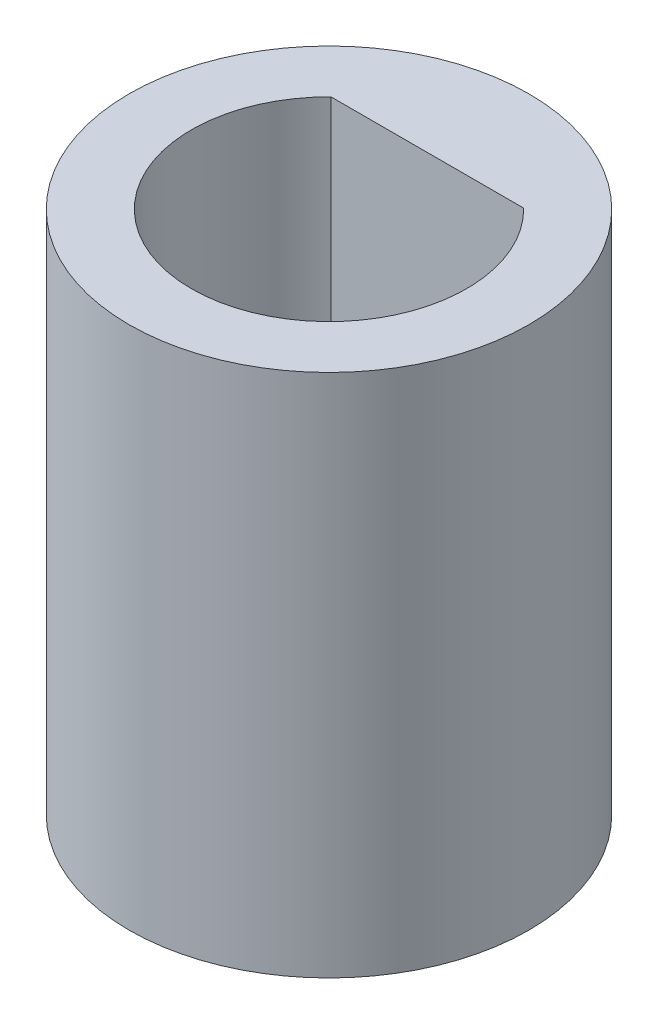
ISO-10303-21;
HEADER;
FILE_DESCRIPTION(('STEP AP214'),'2;1');
FILE_NAME('part.step','',(''),(''),'','','');
FILE_SCHEMA(('AUTOMOTIVE_DESIGN { 1 0 10303 214 1 1 1 1 }'));
ENDSEC;
DATA;
#1=APPLICATION_CONTEXT('core data for automotive mechanical design processes');
#2=APPLICATION_PROTOCOL_DEFINITION('international standard','automotive_design',2000,#1);
#3=PRODUCT_CONTEXT('',#1,'mechanical');
#4=PRODUCT('Part','Part','',(#3));
#5=PRODUCT_RELATED_PRODUCT_CATEGORY('part','',(#4));
#6=PRODUCT_DEFINITION_FORMATION('','',#4);
#7=PRODUCT_DEFINITION_CONTEXT('part definition',#1,'design');
#8=PRODUCT_DEFINITION('design','',#6,#7);
#9=PRODUCT_DEFINITION_SHAPE('','',#8);
#10=(LENGTH_UNIT() NAMED_UNIT(*) SI_UNIT(.MILLI.,.METRE.));
#11=(NAMED_UNIT(*) PLANE_ANGLE_UNIT() SI_UNIT($,.RADIAN.));
#12=(NAMED_UNIT(*) SI_UNIT($,.STERADIAN.) SOLID_ANGLE_UNIT());
#13=UNCERTAINTY_MEASURE_WITH_UNIT(LENGTH_MEASURE(1.E-05),#10,'distance_accuracy_value','');
#14=(GEOMETRIC_REPRESENTATION_CONTEXT(3) GLOBAL_UNCERTAINTY_ASSIGNED_CONTEXT((#13)) GLOBAL_UNIT_ASSIGNED_CONTEXT((#10,
#11,#12)) REPRESENTATION_CONTEXT('',''));
#15=CARTESIAN_POINT('',(0.,0.,0.));
#16=DIRECTION('',(0.,0.,1.));
#17=DIRECTION('',(1.,0.,0.));
#18=AXIS2_PLACEMENT_3D('',#15,#16,#17);
#19=CARTESIAN_POINT('',(0.,8.,0.));
#20=DIRECTION('',(0.,1.,0.));
#21=DIRECTION('',(0.,0.,1.));
#22=AXIS2_PLACEMENT_3D('',#19,#20,#21);
#23=PLANE('',#22);
#24=CARTESIAN_POINT('',(0.,8.,0.));
#25=DIRECTION('',(0.,1.,0.));
#26=DIRECTION('',(0.,0.,1.));
#27=AXIS2_PLACEMENT_3D('',#24,#25,#26);
#28=CIRCLE('',#27,3.05);
#29=CARTESIAN_POINT('',(0.,8.,3.05));
#30=VERTEX_POINT('',#29);
#31=EDGE_CURVE('E11',#30,#30,#28,.T.);
#32=ORIENTED_EDGE('',*,*,#31,.T.);
#33=EDGE_LOOP('',(#32));
#34=FACE_BOUND('',#33,.T.);
#35=DIRECTION('',(-1.,0.,0.));
#36=VECTOR('',#35,1.);
#37=CARTESIAN_POINT('',(-1.46969384566991,8.,-1.5));
#38=LINE('',#37,#36);
#39=CARTESIAN_POINT('',(1.46969384566991,8.,-1.5));
#40=VERTEX_POINT('',#39);
#41=CARTESIAN_POINT('',(-1.46969384566991,8.,-1.5));
#42=VERTEX_POINT('',#41);
#43=EDGE_CURVE('E74',#40,#42,#38,.T.);
#44=ORIENTED_EDGE('',*,*,#43,.F.);
#45=CARTESIAN_POINT('',(0.,8.,0.));
#46=DIRECTION('',(0.,1.,0.));
#47=DIRECTION('',(0.,0.,1.));
#48=AXIS2_PLACEMENT_3D('',#45,#46,#47);
#49=CIRCLE('',#48,2.1);
#50=EDGE_CURVE('E65',#42,#40,#49,.T.);
#51=ORIENTED_EDGE('',*,*,#50,.F.);
#52=EDGE_LOOP('',(#44,#51));
#53=FACE_BOUND('',#52,.T.);
#54=ADVANCED_FACE('F33',(#34,#53),#23,.T.);
#55=CARTESIAN_POINT('',(0.,0.,0.));
#56=DIRECTION('',(0.,1.,0.));
#57=DIRECTION('',(0.,0.,1.));
#58=AXIS2_PLACEMENT_3D('',#55,#56,#57);
#59=PLANE('',#58);
#60=CARTESIAN_POINT('',(0.,0.,0.));
#61=DIRECTION('',(0.,1.,0.));
#62=DIRECTION('',(0.,0.,1.));
#63=AXIS2_PLACEMENT_3D('',#60,#61,#62);
#64=CIRCLE('',#63,3.05);
#65=CARTESIAN_POINT('',(0.,0.,3.05));
#66=VERTEX_POINT('',#65);
#67=EDGE_CURVE('E37',#66,#66,#64,.T.);
#68=ORIENTED_EDGE('',*,*,#67,.F.);
#69=EDGE_LOOP('',(#68));
#70=FACE_BOUND('',#69,.T.);
#71=CARTESIAN_POINT('',(0.,0.,0.));
#72=DIRECTION('',(0.,1.,0.));
#73=DIRECTION('',(0.,0.,1.));
#74=AXIS2_PLACEMENT_3D('',#71,#72,#73);
#75=CIRCLE('',#74,2.1);
#76=CARTESIAN_POINT('',(-1.46969384566991,0.,-1.5));
#77=VERTEX_POINT('',#76);
#78=CARTESIAN_POINT('',(1.46969384566991,0.,-1.5));
#79=VERTEX_POINT('',#78);
#80=EDGE_CURVE('E55',#77,#79,#75,.T.);
#81=ORIENTED_EDGE('',*,*,#80,.T.);
#82=DIRECTION('',(-1.,0.,0.));
#83=VECTOR('',#82,1.);
#84=CARTESIAN_POINT('',(-1.46969384566991,0.,-1.5));
#85=LINE('',#84,#83);
#86=EDGE_CURVE('E61',#79,#77,#85,.T.);
#87=ORIENTED_EDGE('',*,*,#86,.T.);
#88=EDGE_LOOP('',(#81,#87));
#89=FACE_BOUND('',#88,.T.);
#90=ADVANCED_FACE('F71',(#70,#89),#59,.F.);
#91=CARTESIAN_POINT('',(0.,8.,0.));
#92=DIRECTION('',(0.,-1.,0.));
#93=DIRECTION('',(0.,0.,-1.));
#94=AXIS2_PLACEMENT_3D('',#91,#92,#93);
#95=CYLINDRICAL_SURFACE('',#94,3.05);
#96=ORIENTED_EDGE('',*,*,#31,.F.);
#97=EDGE_LOOP('',(#96));
#98=FACE_BOUND('',#97,.T.);
#99=ORIENTED_EDGE('',*,*,#67,.T.);
#100=EDGE_LOOP('',(#99));
#101=FACE_BOUND('',#100,.T.);
#102=ADVANCED_FACE('F35',(#98,#101),#95,.T.);
#103=CARTESIAN_POINT('',(0.,8.,0.));
#104=DIRECTION('',(0.,-1.,0.));
#105=DIRECTION('',(0.,0.,-1.));
#106=AXIS2_PLACEMENT_3D('',#103,#104,#105);
#107=CYLINDRICAL_SURFACE('',#106,2.1);
#108=ORIENTED_EDGE('',*,*,#80,.F.);
#109=DIRECTION('',(0.,-1.,0.));
#110=VECTOR('',#109,1.);
#111=CARTESIAN_POINT('',(-1.46969384566991,8.,-1.5));
#112=LINE('',#111,#110);
#113=EDGE_CURVE('E63',#42,#77,#112,.T.);
#114=ORIENTED_EDGE('',*,*,#113,.F.);
#115=ORIENTED_EDGE('',*,*,#50,.T.);
#116=DIRECTION('',(0.,-1.,0.));
#117=VECTOR('',#116,1.);
#118=CARTESIAN_POINT('',(1.46969384566991,8.,-1.5));
#119=LINE('',#118,#117);
#120=EDGE_CURVE('E48',#40,#79,#119,.T.);
#121=ORIENTED_EDGE('',*,*,#120,.T.);
#122=EDGE_LOOP('',(#108,#114,#115,#121));
#123=FACE_BOUND('',#122,.T.);
#124=ADVANCED_FACE('F67',(#123),#107,.F.);
#125=CARTESIAN_POINT('',(-1.46969384566991,8.,-1.5));
#126=DIRECTION('',(0.,0.,1.));
#127=DIRECTION('',(1.,0.,0.));
#128=AXIS2_PLACEMENT_3D('',#125,#126,#127);
#129=PLANE('',#128);
#130=ORIENTED_EDGE('',*,*,#86,.F.);
#131=ORIENTED_EDGE('',*,*,#120,.F.);
#132=ORIENTED_EDGE('',*,*,#43,.T.);
#133=ORIENTED_EDGE('',*,*,#113,.T.);
#134=EDGE_LOOP('',(#130,#131,#132,#133));
#135=FACE_BOUND('',#134,.T.);
#136=ADVANCED_FACE('F62',(#135),#129,.T.);
#137=CLOSED_SHELL('',(#54,#90,#102,#124,#136));
#138=MANIFOLD_SOLID_BREP('B2',#137);
#139=ADVANCED_BREP_SHAPE_REPRESENTATION('',(#18,#138),#14);
#140=SHAPE_DEFINITION_REPRESENTATION(#9,#139);
ENDSEC;
END-ISO-10303-21;
